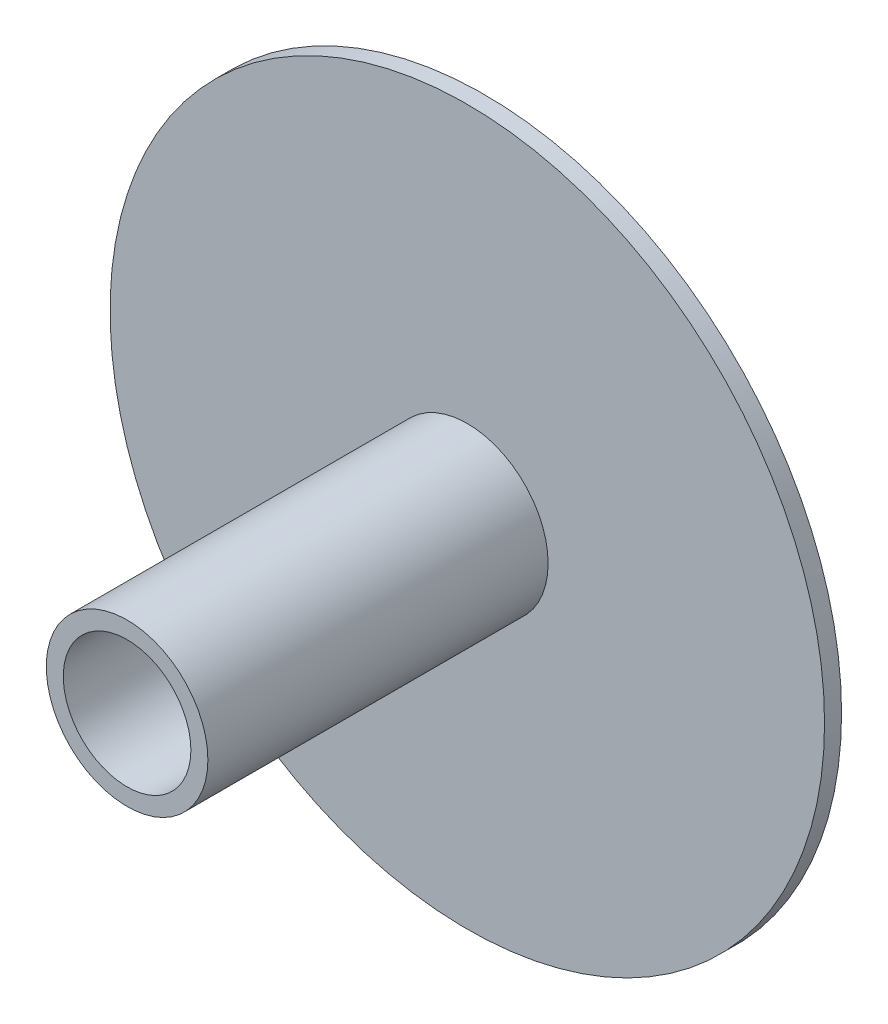
ISO-10303-21;
HEADER;
FILE_DESCRIPTION(('STEP AP214'),'2;1');
FILE_NAME('part.step','',(''),(''),'','','');
FILE_SCHEMA(('AUTOMOTIVE_DESIGN { 1 0 10303 214 1 1 1 1 }'));
ENDSEC;
DATA;
#1=APPLICATION_CONTEXT('core data for automotive mechanical design processes');
#2=APPLICATION_PROTOCOL_DEFINITION('international standard','automotive_design',2000,#1);
#3=PRODUCT_CONTEXT('',#1,'mechanical');
#4=PRODUCT('Part','Part','',(#3));
#5=PRODUCT_RELATED_PRODUCT_CATEGORY('part','',(#4));
#6=PRODUCT_DEFINITION_FORMATION('','',#4);
#7=PRODUCT_DEFINITION_CONTEXT('part definition',#1,'design');
#8=PRODUCT_DEFINITION('design','',#6,#7);
#9=PRODUCT_DEFINITION_SHAPE('','',#8);
#10=(LENGTH_UNIT() NAMED_UNIT(*) SI_UNIT(.MILLI.,.METRE.));
#11=(NAMED_UNIT(*) PLANE_ANGLE_UNIT() SI_UNIT($,.RADIAN.));
#12=(NAMED_UNIT(*) SI_UNIT($,.STERADIAN.) SOLID_ANGLE_UNIT());
#13=UNCERTAINTY_MEASURE_WITH_UNIT(LENGTH_MEASURE(1.E-05),#10,'distance_accuracy_value','');
#14=(GEOMETRIC_REPRESENTATION_CONTEXT(3) GLOBAL_UNCERTAINTY_ASSIGNED_CONTEXT((#13)) GLOBAL_UNIT_ASSIGNED_CONTEXT((#10,
#11,#12)) REPRESENTATION_CONTEXT('',''));
#15=CARTESIAN_POINT('',(0.,0.,0.));
#16=DIRECTION('',(0.,0.,1.));
#17=DIRECTION('',(1.,0.,0.));
#18=AXIS2_PLACEMENT_3D('',#15,#16,#17);
#19=CARTESIAN_POINT('',(0.,0.,1.));
#20=DIRECTION('',(0.,0.,-1.));
#21=DIRECTION('',(-1.,0.,0.));
#22=AXIS2_PLACEMENT_3D('',#19,#20,#21);
#23=CYLINDRICAL_SURFACE('',#22,21.);
#24=CARTESIAN_POINT('',(0.,0.,1.));
#25=DIRECTION('',(0.,0.,1.));
#26=DIRECTION('',(1.,0.,0.));
#27=AXIS2_PLACEMENT_3D('',#24,#25,#26);
#28=CIRCLE('',#27,21.);
#29=CARTESIAN_POINT('',(21.,0.,1.));
#30=VERTEX_POINT('',#29);
#31=EDGE_CURVE('E10',#30,#30,#28,.T.);
#32=ORIENTED_EDGE('',*,*,#31,.F.);
#33=EDGE_LOOP('',(#32));
#34=FACE_BOUND('',#33,.T.);
#35=CARTESIAN_POINT('',(0.,0.,0.));
#36=DIRECTION('',(0.,0.,1.));
#37=DIRECTION('',(1.,0.,0.));
#38=AXIS2_PLACEMENT_3D('',#35,#36,#37);
#39=CIRCLE('',#38,21.);
#40=CARTESIAN_POINT('',(21.,0.,0.));
#41=VERTEX_POINT('',#40);
#42=EDGE_CURVE('E40',#41,#41,#39,.T.);
#43=ORIENTED_EDGE('',*,*,#42,.T.);
#44=EDGE_LOOP('',(#43));
#45=FACE_BOUND('',#44,.T.);
#46=ADVANCED_FACE('F33',(#34,#45),#23,.T.);
#47=CARTESIAN_POINT('',(0.,0.,1.));
#48=DIRECTION('',(0.,0.,1.));
#49=DIRECTION('',(1.,0.,0.));
#50=AXIS2_PLACEMENT_3D('',#47,#48,#49);
#51=PLANE('',#50);
#52=CARTESIAN_POINT('',(0.,0.,1.));
#53=DIRECTION('',(0.,0.,1.));
#54=DIRECTION('',(1.,0.,0.));
#55=AXIS2_PLACEMENT_3D('',#52,#53,#54);
#56=CIRCLE('',#55,4.75);
#57=CARTESIAN_POINT('',(4.75,0.,1.));
#58=VERTEX_POINT('',#57);
#59=EDGE_CURVE('E47',#58,#58,#56,.T.);
#60=ORIENTED_EDGE('',*,*,#59,.F.);
#61=EDGE_LOOP('',(#60));
#62=FACE_BOUND('',#61,.T.);
#63=ORIENTED_EDGE('',*,*,#31,.T.);
#64=EDGE_LOOP('',(#63));
#65=FACE_BOUND('',#64,.T.);
#66=ADVANCED_FACE('F75',(#62,#65),#51,.T.);
#67=CARTESIAN_POINT('',(0.,0.,0.));
#68=DIRECTION('',(0.,0.,1.));
#69=DIRECTION('',(1.,0.,0.));
#70=AXIS2_PLACEMENT_3D('',#67,#68,#69);
#71=PLANE('',#70);
#72=CARTESIAN_POINT('',(0.,0.,0.));
#73=DIRECTION('',(0.,0.,1.));
#74=DIRECTION('',(1.,0.,0.));
#75=AXIS2_PLACEMENT_3D('',#72,#73,#74);
#76=CIRCLE('',#75,3.75);
#77=CARTESIAN_POINT('',(3.75,0.,0.));
#78=VERTEX_POINT('',#77);
#79=EDGE_CURVE('E52',#78,#78,#76,.T.);
#80=ORIENTED_EDGE('',*,*,#79,.T.);
#81=EDGE_LOOP('',(#80));
#82=FACE_BOUND('',#81,.T.);
#83=ORIENTED_EDGE('',*,*,#42,.F.);
#84=EDGE_LOOP('',(#83));
#85=FACE_BOUND('',#84,.T.);
#86=ADVANCED_FACE('F71',(#82,#85),#71,.F.);
#87=CARTESIAN_POINT('',(0.,0.,21.));
#88=DIRECTION('',(0.,0.,-1.));
#89=DIRECTION('',(-1.,0.,0.));
#90=AXIS2_PLACEMENT_3D('',#87,#88,#89);
#91=CYLINDRICAL_SURFACE('',#90,4.75);
#92=CARTESIAN_POINT('',(0.,0.,21.));
#93=DIRECTION('',(0.,0.,1.));
#94=DIRECTION('',(1.,0.,0.));
#95=AXIS2_PLACEMENT_3D('',#92,#93,#94);
#96=CIRCLE('',#95,4.75);
#97=CARTESIAN_POINT('',(4.75,0.,21.));
#98=VERTEX_POINT('',#97);
#99=EDGE_CURVE('E45',#98,#98,#96,.T.);
#100=ORIENTED_EDGE('',*,*,#99,.F.);
#101=EDGE_LOOP('',(#100));
#102=FACE_BOUND('',#101,.T.);
#103=ORIENTED_EDGE('',*,*,#59,.T.);
#104=EDGE_LOOP('',(#103));
#105=FACE_BOUND('',#104,.T.);
#106=ADVANCED_FACE('F65',(#102,#105),#91,.T.);
#107=CARTESIAN_POINT('',(0.,0.,21.));
#108=DIRECTION('',(0.,0.,1.));
#109=DIRECTION('',(1.,0.,0.));
#110=AXIS2_PLACEMENT_3D('',#107,#108,#109);
#111=PLANE('',#110);
#112=CARTESIAN_POINT('',(0.,0.,21.));
#113=DIRECTION('',(0.,0.,1.));
#114=DIRECTION('',(1.,0.,0.));
#115=AXIS2_PLACEMENT_3D('',#112,#113,#114);
#116=CIRCLE('',#115,3.75);
#117=CARTESIAN_POINT('',(3.75,0.,21.));
#118=VERTEX_POINT('',#117);
#119=EDGE_CURVE('E36',#118,#118,#116,.T.);
#120=ORIENTED_EDGE('',*,*,#119,.F.);
#121=EDGE_LOOP('',(#120));
#122=FACE_BOUND('',#121,.T.);
#123=ORIENTED_EDGE('',*,*,#99,.T.);
#124=EDGE_LOOP('',(#123));
#125=FACE_BOUND('',#124,.T.);
#126=ADVANCED_FACE('F62',(#122,#125),#111,.T.);
#127=CARTESIAN_POINT('',(0.,0.,0.));
#128=DIRECTION('',(0.,0.,1.));
#129=DIRECTION('',(1.,0.,0.));
#130=AXIS2_PLACEMENT_3D('',#127,#128,#129);
#131=CYLINDRICAL_SURFACE('',#130,3.75);
#132=CARTESIAN_POINT('',(3.75,0.,21.));
#133=CARTESIAN_POINT('',(3.75,0.,20.78125));
#134=CARTESIAN_POINT('',(3.75,0.,20.5625));
#135=CARTESIAN_POINT('',(3.75,0.,20.125));
#136=CARTESIAN_POINT('',(3.75,0.,19.90625));
#137=CARTESIAN_POINT('',(3.75,0.,19.46875));
#138=CARTESIAN_POINT('',(3.75,0.,19.25));
#139=CARTESIAN_POINT('',(3.75,0.,18.8125));
#140=CARTESIAN_POINT('',(3.75,0.,18.59375));
#141=CARTESIAN_POINT('',(3.75,0.,18.15625));
#142=CARTESIAN_POINT('',(3.75,0.,17.9375));
#143=CARTESIAN_POINT('',(3.75,0.,17.5));
#144=CARTESIAN_POINT('',(3.75,0.,17.28125));
#145=CARTESIAN_POINT('',(3.75,0.,16.84375));
#146=CARTESIAN_POINT('',(3.75,0.,16.625));
#147=CARTESIAN_POINT('',(3.75,0.,16.1875));
#148=CARTESIAN_POINT('',(3.75,0.,15.96875));
#149=CARTESIAN_POINT('',(3.75,0.,15.53125));
#150=CARTESIAN_POINT('',(3.75,0.,15.3125));
#151=CARTESIAN_POINT('',(3.75,0.,14.875));
#152=CARTESIAN_POINT('',(3.75,0.,14.65625));
#153=CARTESIAN_POINT('',(3.75,0.,14.21875));
#154=CARTESIAN_POINT('',(3.75,0.,14.));
#155=CARTESIAN_POINT('',(3.75,0.,13.5625));
#156=CARTESIAN_POINT('',(3.75,0.,13.34375));
#157=CARTESIAN_POINT('',(3.75,0.,12.90625));
#158=CARTESIAN_POINT('',(3.75,0.,12.6875));
#159=CARTESIAN_POINT('',(3.75,0.,12.25));
#160=CARTESIAN_POINT('',(3.75,0.,12.03125));
#161=CARTESIAN_POINT('',(3.75,0.,11.59375));
#162=CARTESIAN_POINT('',(3.75,0.,11.375));
#163=CARTESIAN_POINT('',(3.75,0.,10.9375));
#164=CARTESIAN_POINT('',(3.75,0.,10.71875));
#165=CARTESIAN_POINT('',(3.75,0.,10.28125));
#166=CARTESIAN_POINT('',(3.75,0.,10.0625));
#167=CARTESIAN_POINT('',(3.75,0.,9.625));
#168=CARTESIAN_POINT('',(3.75,0.,9.40625));
#169=CARTESIAN_POINT('',(3.75,0.,8.96875));
#170=CARTESIAN_POINT('',(3.75,0.,8.75));
#171=CARTESIAN_POINT('',(3.75,0.,8.3125));
#172=CARTESIAN_POINT('',(3.75,0.,8.09375));
#173=CARTESIAN_POINT('',(3.75,0.,7.65625));
#174=CARTESIAN_POINT('',(3.75,0.,7.4375));
#175=CARTESIAN_POINT('',(3.75,0.,7.));
#176=CARTESIAN_POINT('',(3.75,0.,6.78125));
#177=CARTESIAN_POINT('',(3.75,0.,6.34375));
#178=CARTESIAN_POINT('',(3.75,0.,6.125));
#179=CARTESIAN_POINT('',(3.75,0.,5.6875));
#180=CARTESIAN_POINT('',(3.75,0.,5.46875));
#181=CARTESIAN_POINT('',(3.75,0.,5.03125));
#182=CARTESIAN_POINT('',(3.75,0.,4.8125));
#183=CARTESIAN_POINT('',(3.75,0.,4.375));
#184=CARTESIAN_POINT('',(3.75,0.,4.15625));
#185=CARTESIAN_POINT('',(3.75,0.,3.71875));
#186=CARTESIAN_POINT('',(3.75,0.,3.5));
#187=CARTESIAN_POINT('',(3.75,0.,3.0625));
#188=CARTESIAN_POINT('',(3.75,0.,2.84375));
#189=CARTESIAN_POINT('',(3.75,0.,2.40625));
#190=CARTESIAN_POINT('',(3.75,0.,2.1875));
#191=CARTESIAN_POINT('',(3.75,0.,1.75));
#192=CARTESIAN_POINT('',(3.75,0.,1.53125));
#193=CARTESIAN_POINT('',(3.75,0.,1.09375));
#194=CARTESIAN_POINT('',(3.75,0.,0.875000000000001));
#195=CARTESIAN_POINT('',(3.75,0.,0.4375));
#196=CARTESIAN_POINT('',(3.75,0.,0.218750000000001));
#197=CARTESIAN_POINT('',(3.75,0.,0.));
#198=B_SPLINE_CURVE_WITH_KNOTS('',3,(#132,#133,#134,#135,#136,#137,#138,#139,#140,#141,#142,
#143,#144,#145,#146,#147,#148,#149,#150,#151,#152,#153,#154,#155,#156,#157,#158,#159,#160,#161,
#162,#163,#164,#165,#166,#167,#168,#169,#170,#171,#172,#173,#174,#175,#176,#177,#178,#179,#180,
#181,#182,#183,#184,#185,#186,#187,#188,#189,#190,#191,#192,#193,#194,#195,#196,#197),
.UNSPECIFIED.,.F.,.F.,(4,2,2,2,2,2,2,2,2,2,2,2,2,2,2,2,2,2,2,2,2,2,2,2,2,2,2,2,2,2,2,2,4),(0.,
0.656250000000001,1.3125,1.96875,2.625,3.28125,3.9375,4.59375,5.25,5.90625,6.5625,7.21875,7.875,
8.53125,9.1875,9.84375,10.5,11.15625,11.8125,12.46875,13.125,13.78125,14.4375,15.09375,15.75,
16.40625,17.0625,17.71875,18.375,19.03125,19.6875,20.34375,21.),.UNSPECIFIED.);
#199=EDGE_CURVE('BSEAM59',#118,#78,#198,.T.);
#200=ORIENTED_EDGE('',*,*,#119,.T.);
#201=ORIENTED_EDGE('',*,*,#79,.F.);
#202=ORIENTED_EDGE('',*,*,#199,.T.);
#203=ORIENTED_EDGE('',*,*,#199,.F.);
#204=EDGE_LOOP('',(#200,#202,#201,#203));
#205=FACE_BOUND('',#204,.T.);
#206=ADVANCED_FACE('F59',(#205),#131,.F.);
#207=CLOSED_SHELL('',(#46,#66,#86,#106,#126,#206));
#208=MANIFOLD_SOLID_BREP('B2',#207);
#209=ADVANCED_BREP_SHAPE_REPRESENTATION('',(#18,#208),#14);
#210=SHAPE_DEFINITION_REPRESENTATION(#9,#209);
ENDSEC;
END-ISO-10303-21;
